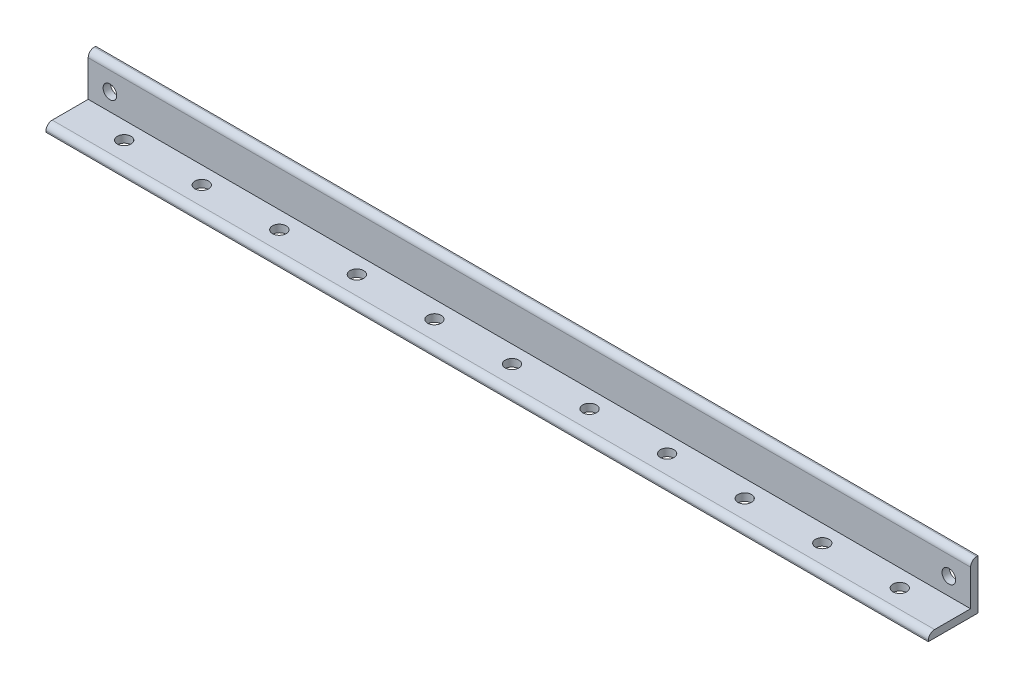
ISO-10303-21;
HEADER;
FILE_DESCRIPTION(('STEP AP214'),'2;1');
FILE_NAME('part.step','',(''),(''),'','','');
FILE_SCHEMA(('AUTOMOTIVE_DESIGN { 1 0 10303 214 1 1 1 1 }'));
ENDSEC;
DATA;
#1=APPLICATION_CONTEXT('core data for automotive mechanical design processes');
#2=APPLICATION_PROTOCOL_DEFINITION('international standard','automotive_design',2000,#1);
#3=PRODUCT_CONTEXT('',#1,'mechanical');
#4=PRODUCT('Part','Part','',(#3));
#5=PRODUCT_RELATED_PRODUCT_CATEGORY('part','',(#4));
#6=PRODUCT_DEFINITION_FORMATION('','',#4);
#7=PRODUCT_DEFINITION_CONTEXT('part definition',#1,'design');
#8=PRODUCT_DEFINITION('design','',#6,#7);
#9=PRODUCT_DEFINITION_SHAPE('','',#8);
#10=(LENGTH_UNIT() NAMED_UNIT(*) SI_UNIT(.MILLI.,.METRE.));
#11=(NAMED_UNIT(*) PLANE_ANGLE_UNIT() SI_UNIT($,.RADIAN.));
#12=(NAMED_UNIT(*) SI_UNIT($,.STERADIAN.) SOLID_ANGLE_UNIT());
#13=UNCERTAINTY_MEASURE_WITH_UNIT(LENGTH_MEASURE(1.E-05),#10,'distance_accuracy_value','');
#14=(GEOMETRIC_REPRESENTATION_CONTEXT(3) GLOBAL_UNCERTAINTY_ASSIGNED_CONTEXT((#13)) GLOBAL_UNIT_ASSIGNED_CONTEXT((#10,
#11,#12)) REPRESENTATION_CONTEXT('',''));
#15=CARTESIAN_POINT('',(0.,0.,0.));
#16=DIRECTION('',(0.,0.,1.));
#17=DIRECTION('',(1.,0.,0.));
#18=AXIS2_PLACEMENT_3D('',#15,#16,#17);
#19=CARTESIAN_POINT('',(0.,0.,80.));
#20=DIRECTION('',(1.,0.,0.));
#21=DIRECTION('',(0.,0.,-1.));
#22=AXIS2_PLACEMENT_3D('',#19,#20,#21);
#23=PLANE('',#22);
#24=DIRECTION('',(0.,-1.,0.));
#25=VECTOR('',#24,1.);
#26=CARTESIAN_POINT('',(0.,0.,80.));
#27=LINE('',#26,#25);
#28=CARTESIAN_POINT('',(0.,2.,80.));
#29=VERTEX_POINT('',#28);
#30=CARTESIAN_POINT('',(0.,0.,80.));
#31=VERTEX_POINT('',#30);
#32=EDGE_CURVE('E128',#29,#31,#27,.T.);
#33=ORIENTED_EDGE('',*,*,#32,.F.);
#34=CARTESIAN_POINT('',(0.,2.,70.));
#35=DIRECTION('',(1.,0.,0.));
#36=DIRECTION('',(0.,0.,-1.));
#37=AXIS2_PLACEMENT_3D('',#34,#35,#36);
#38=CIRCLE('',#37,10.);
#39=CARTESIAN_POINT('',(0.,12.,70.));
#40=VERTEX_POINT('',#39);
#41=EDGE_CURVE('E160',#29,#40,#38,.F.);
#42=ORIENTED_EDGE('',*,*,#41,.T.);
#43=DIRECTION('',(0.,0.,1.));
#44=VECTOR('',#43,1.);
#45=CARTESIAN_POINT('',(0.,12.,12.));
#46=LINE('',#45,#44);
#47=CARTESIAN_POINT('',(0.,12.,12.));
#48=VERTEX_POINT('',#47);
#49=EDGE_CURVE('E106',#48,#40,#46,.T.);
#50=ORIENTED_EDGE('',*,*,#49,.F.);
#51=DIRECTION('',(0.,-1.,0.));
#52=VECTOR('',#51,1.);
#53=CARTESIAN_POINT('',(0.,80.,12.));
#54=LINE('',#53,#52);
#55=CARTESIAN_POINT('',(0.,70.,12.));
#56=VERTEX_POINT('',#55);
#57=EDGE_CURVE('E112',#56,#48,#54,.T.);
#58=ORIENTED_EDGE('',*,*,#57,.F.);
#59=CARTESIAN_POINT('',(0.,70.,2.));
#60=DIRECTION('',(1.,0.,0.));
#61=DIRECTION('',(0.,0.,-1.));
#62=AXIS2_PLACEMENT_3D('',#59,#60,#61);
#63=CIRCLE('',#62,10.);
#64=CARTESIAN_POINT('',(0.,80.,2.));
#65=VERTEX_POINT('',#64);
#66=EDGE_CURVE('E158',#56,#65,#63,.F.);
#67=ORIENTED_EDGE('',*,*,#66,.T.);
#68=DIRECTION('',(0.,0.,-1.));
#69=VECTOR('',#68,1.);
#70=CARTESIAN_POINT('',(0.,80.,80.));
#71=LINE('',#70,#69);
#72=CARTESIAN_POINT('',(0.,80.,0.));
#73=VERTEX_POINT('',#72);
#74=EDGE_CURVE('E136',#65,#73,#71,.T.);
#75=ORIENTED_EDGE('',*,*,#74,.T.);
#76=DIRECTION('',(0.,-1.,0.));
#77=VECTOR('',#76,1.);
#78=CARTESIAN_POINT('',(0.,0.,0.));
#79=LINE('',#78,#77);
#80=CARTESIAN_POINT('',(0.,0.,0.));
#81=VERTEX_POINT('',#80);
#82=EDGE_CURVE('E116',#73,#81,#79,.T.);
#83=ORIENTED_EDGE('',*,*,#82,.T.);
#84=DIRECTION('',(0.,0.,-1.));
#85=VECTOR('',#84,1.);
#86=CARTESIAN_POINT('',(0.,0.,80.));
#87=LINE('',#86,#85);
#88=EDGE_CURVE('E152',#31,#81,#87,.T.);
#89=ORIENTED_EDGE('',*,*,#88,.F.);
#90=EDGE_LOOP('',(#33,#42,#50,#58,#67,#75,#83,#89));
#91=FACE_BOUND('',#90,.T.);
#92=ADVANCED_FACE('F33',(#91),#23,.F.);
#93=CARTESIAN_POINT('',(0.,0.,80.));
#94=DIRECTION('',(0.,1.,0.));
#95=DIRECTION('',(0.,0.,1.));
#96=AXIS2_PLACEMENT_3D('',#93,#94,#95);
#97=PLANE('',#96);
#98=CARTESIAN_POINT('',(211.,0.,40.));
#99=DIRECTION('',(0.,-1.,0.));
#100=DIRECTION('',(0.,0.,-1.));
#101=AXIS2_PLACEMENT_3D('',#98,#99,#100);
#102=CIRCLE('',#101,10.9999999999999);
#103=CARTESIAN_POINT('',(211.,0.,29.0000000000001));
#104=VERTEX_POINT('',#103);
#105=EDGE_CURVE('E481',#104,#104,#102,.T.);
#106=ORIENTED_EDGE('',*,*,#105,.F.);
#107=EDGE_LOOP('',(#106));
#108=FACE_BOUND('',#107,.T.);
#109=CARTESIAN_POINT('',(86.,0.,40.));
#110=DIRECTION('',(0.,-1.,0.));
#111=DIRECTION('',(0.,0.,-1.));
#112=AXIS2_PLACEMENT_3D('',#109,#110,#111);
#113=CIRCLE('',#112,10.9999999999999);
#114=CARTESIAN_POINT('',(86.,0.,29.0000000000001));
#115=VERTEX_POINT('',#114);
#116=EDGE_CURVE('E180',#115,#115,#113,.T.);
#117=ORIENTED_EDGE('',*,*,#116,.F.);
#118=EDGE_LOOP('',(#117));
#119=FACE_BOUND('',#118,.T.);
#120=DIRECTION('',(1.,0.,0.));
#121=VECTOR('',#120,1.);
#122=CARTESIAN_POINT('',(0.,0.,0.));
#123=LINE('',#122,#121);
#124=CARTESIAN_POINT('',(1422.,0.,0.));
#125=VERTEX_POINT('',#124);
#126=EDGE_CURVE('E139',#81,#125,#123,.T.);
#127=ORIENTED_EDGE('',*,*,#126,.T.);
#128=DIRECTION('',(0.,0.,-1.));
#129=VECTOR('',#128,1.);
#130=CARTESIAN_POINT('',(1422.,0.,80.));
#131=LINE('',#130,#129);
#132=CARTESIAN_POINT('',(1422.,0.,80.));
#133=VERTEX_POINT('',#132);
#134=EDGE_CURVE('E149',#133,#125,#131,.T.);
#135=ORIENTED_EDGE('',*,*,#134,.F.);
#136=DIRECTION('',(1.,0.,0.));
#137=VECTOR('',#136,1.);
#138=CARTESIAN_POINT('',(0.,0.,80.));
#139=LINE('',#138,#137);
#140=EDGE_CURVE('E130',#31,#133,#139,.T.);
#141=ORIENTED_EDGE('',*,*,#140,.F.);
#142=ORIENTED_EDGE('',*,*,#88,.T.);
#143=EDGE_LOOP('',(#127,#135,#141,#142));
#144=FACE_BOUND('',#143,.T.);
#145=CARTESIAN_POINT('',(336.,0.,40.));
#146=DIRECTION('',(0.,-1.,0.));
#147=DIRECTION('',(0.,0.,-1.));
#148=AXIS2_PLACEMENT_3D('',#145,#146,#147);
#149=CIRCLE('',#148,10.9999999999999);
#150=CARTESIAN_POINT('',(336.,0.,29.0000000000001));
#151=VERTEX_POINT('',#150);
#152=EDGE_CURVE('E169',#151,#151,#149,.T.);
#153=ORIENTED_EDGE('',*,*,#152,.F.);
#154=EDGE_LOOP('',(#153));
#155=FACE_BOUND('',#154,.T.);
#156=CARTESIAN_POINT('',(461.,0.,40.));
#157=DIRECTION('',(0.,-1.,0.));
#158=DIRECTION('',(0.,0.,-1.));
#159=AXIS2_PLACEMENT_3D('',#156,#157,#158);
#160=CIRCLE('',#159,10.9999999999999);
#161=CARTESIAN_POINT('',(461.,0.,29.0000000000001));
#162=VERTEX_POINT('',#161);
#163=EDGE_CURVE('E186',#162,#162,#160,.T.);
#164=ORIENTED_EDGE('',*,*,#163,.F.);
#165=EDGE_LOOP('',(#164));
#166=FACE_BOUND('',#165,.T.);
#167=CARTESIAN_POINT('',(586.,0.,40.));
#168=DIRECTION('',(0.,-1.,0.));
#169=DIRECTION('',(0.,0.,-1.));
#170=AXIS2_PLACEMENT_3D('',#167,#168,#169);
#171=CIRCLE('',#170,10.9999999999999);
#172=CARTESIAN_POINT('',(586.,0.,29.0000000000001));
#173=VERTEX_POINT('',#172);
#174=EDGE_CURVE('E192',#173,#173,#171,.T.);
#175=ORIENTED_EDGE('',*,*,#174,.F.);
#176=EDGE_LOOP('',(#175));
#177=FACE_BOUND('',#176,.T.);
#178=CARTESIAN_POINT('',(711.,0.,40.));
#179=DIRECTION('',(0.,-1.,0.));
#180=DIRECTION('',(0.,0.,-1.));
#181=AXIS2_PLACEMENT_3D('',#178,#179,#180);
#182=CIRCLE('',#181,10.9999999999999);
#183=CARTESIAN_POINT('',(711.,0.,29.0000000000001));
#184=VERTEX_POINT('',#183);
#185=EDGE_CURVE('E198',#184,#184,#182,.T.);
#186=ORIENTED_EDGE('',*,*,#185,.F.);
#187=EDGE_LOOP('',(#186));
#188=FACE_BOUND('',#187,.T.);
#189=CARTESIAN_POINT('',(836.,0.,40.));
#190=DIRECTION('',(0.,-1.,0.));
#191=DIRECTION('',(0.,0.,-1.));
#192=AXIS2_PLACEMENT_3D('',#189,#190,#191);
#193=CIRCLE('',#192,10.9999999999999);
#194=CARTESIAN_POINT('',(836.,0.,29.0000000000001));
#195=VERTEX_POINT('',#194);
#196=EDGE_CURVE('E204',#195,#195,#193,.T.);
#197=ORIENTED_EDGE('',*,*,#196,.F.);
#198=EDGE_LOOP('',(#197));
#199=FACE_BOUND('',#198,.T.);
#200=CARTESIAN_POINT('',(961.,0.,40.));
#201=DIRECTION('',(0.,-1.,0.));
#202=DIRECTION('',(0.,0.,-1.));
#203=AXIS2_PLACEMENT_3D('',#200,#201,#202);
#204=CIRCLE('',#203,10.9999999999999);
#205=CARTESIAN_POINT('',(961.,0.,29.0000000000001));
#206=VERTEX_POINT('',#205);
#207=EDGE_CURVE('E210',#206,#206,#204,.T.);
#208=ORIENTED_EDGE('',*,*,#207,.F.);
#209=EDGE_LOOP('',(#208));
#210=FACE_BOUND('',#209,.T.);
#211=CARTESIAN_POINT('',(1086.,0.,40.));
#212=DIRECTION('',(0.,-1.,0.));
#213=DIRECTION('',(0.,0.,-1.));
#214=AXIS2_PLACEMENT_3D('',#211,#212,#213);
#215=CIRCLE('',#214,10.9999999999999);
#216=CARTESIAN_POINT('',(1086.,0.,29.0000000000001));
#217=VERTEX_POINT('',#216);
#218=EDGE_CURVE('E216',#217,#217,#215,.T.);
#219=ORIENTED_EDGE('',*,*,#218,.F.);
#220=EDGE_LOOP('',(#219));
#221=FACE_BOUND('',#220,.T.);
#222=CARTESIAN_POINT('',(1211.,0.,40.));
#223=DIRECTION('',(0.,-1.,0.));
#224=DIRECTION('',(0.,0.,-1.));
#225=AXIS2_PLACEMENT_3D('',#222,#223,#224);
#226=CIRCLE('',#225,10.9999999999999);
#227=CARTESIAN_POINT('',(1211.,0.,29.0000000000001));
#228=VERTEX_POINT('',#227);
#229=EDGE_CURVE('E222',#228,#228,#226,.T.);
#230=ORIENTED_EDGE('',*,*,#229,.F.);
#231=EDGE_LOOP('',(#230));
#232=FACE_BOUND('',#231,.T.);
#233=CARTESIAN_POINT('',(1336.,0.,40.));
#234=DIRECTION('',(0.,-1.,0.));
#235=DIRECTION('',(0.,0.,-1.));
#236=AXIS2_PLACEMENT_3D('',#233,#234,#235);
#237=CIRCLE('',#236,10.9999999999999);
#238=CARTESIAN_POINT('',(1336.,0.,29.0000000000001));
#239=VERTEX_POINT('',#238);
#240=EDGE_CURVE('E41',#239,#239,#237,.T.);
#241=ORIENTED_EDGE('',*,*,#240,.F.);
#242=EDGE_LOOP('',(#241));
#243=FACE_BOUND('',#242,.T.);
#244=ADVANCED_FACE('F232',(#108,#119,#144,#155,#166,#177,#188,#199,#210,#221,#232,#243),#97,.F.);
#245=CARTESIAN_POINT('',(1422.,0.,80.));
#246=DIRECTION('',(-1.,0.,0.));
#247=DIRECTION('',(0.,0.,1.));
#248=AXIS2_PLACEMENT_3D('',#245,#246,#247);
#249=PLANE('',#248);
#250=DIRECTION('',(0.,0.,1.));
#251=VECTOR('',#250,1.);
#252=CARTESIAN_POINT('',(1422.,12.,12.));
#253=LINE('',#252,#251);
#254=CARTESIAN_POINT('',(1422.,12.,12.));
#255=VERTEX_POINT('',#254);
#256=CARTESIAN_POINT('',(1422.,12.,70.));
#257=VERTEX_POINT('',#256);
#258=EDGE_CURVE('E101',#255,#257,#253,.T.);
#259=ORIENTED_EDGE('',*,*,#258,.T.);
#260=CARTESIAN_POINT('',(1422.,2.,70.));
#261=DIRECTION('',(-1.,0.,0.));
#262=DIRECTION('',(0.,0.,1.));
#263=AXIS2_PLACEMENT_3D('',#260,#261,#262);
#264=CIRCLE('',#263,10.);
#265=CARTESIAN_POINT('',(1422.,2.,80.));
#266=VERTEX_POINT('',#265);
#267=EDGE_CURVE('E164',#257,#266,#264,.F.);
#268=ORIENTED_EDGE('',*,*,#267,.T.);
#269=DIRECTION('',(0.,1.,0.));
#270=VECTOR('',#269,1.);
#271=CARTESIAN_POINT('',(1422.,0.,80.));
#272=LINE('',#271,#270);
#273=EDGE_CURVE('E133',#133,#266,#272,.T.);
#274=ORIENTED_EDGE('',*,*,#273,.F.);
#275=ORIENTED_EDGE('',*,*,#134,.T.);
#276=DIRECTION('',(0.,1.,0.));
#277=VECTOR('',#276,1.);
#278=CARTESIAN_POINT('',(1422.,0.,0.));
#279=LINE('',#278,#277);
#280=CARTESIAN_POINT('',(1422.,80.,0.));
#281=VERTEX_POINT('',#280);
#282=EDGE_CURVE('E141',#125,#281,#279,.T.);
#283=ORIENTED_EDGE('',*,*,#282,.T.);
#284=DIRECTION('',(0.,0.,-1.));
#285=VECTOR('',#284,1.);
#286=CARTESIAN_POINT('',(1422.,80.,80.));
#287=LINE('',#286,#285);
#288=CARTESIAN_POINT('',(1422.,80.,2.));
#289=VERTEX_POINT('',#288);
#290=EDGE_CURVE('E147',#289,#281,#287,.T.);
#291=ORIENTED_EDGE('',*,*,#290,.F.);
#292=CARTESIAN_POINT('',(1422.,70.,2.));
#293=DIRECTION('',(-1.,0.,0.));
#294=DIRECTION('',(0.,0.,1.));
#295=AXIS2_PLACEMENT_3D('',#292,#293,#294);
#296=CIRCLE('',#295,10.);
#297=CARTESIAN_POINT('',(1422.,70.,12.));
#298=VERTEX_POINT('',#297);
#299=EDGE_CURVE('E48',#289,#298,#296,.F.);
#300=ORIENTED_EDGE('',*,*,#299,.T.);
#301=DIRECTION('',(0.,-1.,0.));
#302=VECTOR('',#301,1.);
#303=CARTESIAN_POINT('',(1422.,80.,12.));
#304=LINE('',#303,#302);
#305=EDGE_CURVE('E97',#298,#255,#304,.T.);
#306=ORIENTED_EDGE('',*,*,#305,.T.);
#307=EDGE_LOOP('',(#259,#268,#274,#275,#283,#291,#300,#306));
#308=FACE_BOUND('',#307,.T.);
#309=ADVANCED_FACE('F99',(#308),#249,.F.);
#310=CARTESIAN_POINT('',(0.,80.,80.));
#311=DIRECTION('',(0.,-1.,0.));
#312=DIRECTION('',(0.,0.,-1.));
#313=AXIS2_PLACEMENT_3D('',#310,#311,#312);
#314=PLANE('',#313);
#315=ORIENTED_EDGE('',*,*,#74,.F.);
#316=DIRECTION('',(-1.,0.,0.));
#317=VECTOR('',#316,1.);
#318=CARTESIAN_POINT('',(0.,80.,2.));
#319=LINE('',#318,#317);
#320=EDGE_CURVE('E56',#65,#289,#319,.F.);
#321=ORIENTED_EDGE('',*,*,#320,.T.);
#322=ORIENTED_EDGE('',*,*,#290,.T.);
#323=DIRECTION('',(-1.,0.,0.));
#324=VECTOR('',#323,1.);
#325=CARTESIAN_POINT('',(0.,80.,0.));
#326=LINE('',#325,#324);
#327=EDGE_CURVE('E131',#281,#73,#326,.T.);
#328=ORIENTED_EDGE('',*,*,#327,.T.);
#329=EDGE_LOOP('',(#315,#321,#322,#328));
#330=FACE_BOUND('',#329,.T.);
#331=ADVANCED_FACE('F240',(#330),#314,.F.);
#332=CARTESIAN_POINT('',(0.,80.,80.));
#333=DIRECTION('',(0.,0.,-1.));
#334=DIRECTION('',(-1.,0.,0.));
#335=AXIS2_PLACEMENT_3D('',#332,#333,#334);
#336=PLANE('',#335);
#337=ORIENTED_EDGE('',*,*,#273,.T.);
#338=DIRECTION('',(-1.,0.,0.));
#339=VECTOR('',#338,1.);
#340=CARTESIAN_POINT('',(0.,2.,80.));
#341=LINE('',#340,#339);
#342=EDGE_CURVE('E155',#266,#29,#341,.T.);
#343=ORIENTED_EDGE('',*,*,#342,.T.);
#344=ORIENTED_EDGE('',*,*,#32,.T.);
#345=ORIENTED_EDGE('',*,*,#140,.T.);
#346=EDGE_LOOP('',(#337,#343,#344,#345));
#347=FACE_BOUND('',#346,.T.);
#348=ADVANCED_FACE('F311',(#347),#336,.F.);
#349=CARTESIAN_POINT('',(0.,80.,0.));
#350=DIRECTION('',(0.,0.,-1.));
#351=DIRECTION('',(-1.,0.,0.));
#352=AXIS2_PLACEMENT_3D('',#349,#350,#351);
#353=PLANE('',#352);
#354=CARTESIAN_POINT('',(34.9999999999999,40.,0.));
#355=DIRECTION('',(0.,0.,-1.));
#356=DIRECTION('',(-1.,0.,0.));
#357=AXIS2_PLACEMENT_3D('',#354,#355,#356);
#358=CIRCLE('',#357,10.9999999999999);
#359=CARTESIAN_POINT('',(24.,40.,0.));
#360=VERTEX_POINT('',#359);
#361=EDGE_CURVE('E176',#360,#360,#358,.T.);
#362=ORIENTED_EDGE('',*,*,#361,.F.);
#363=EDGE_LOOP('',(#362));
#364=FACE_BOUND('',#363,.T.);
#365=CARTESIAN_POINT('',(1387.,40.,0.));
#366=DIRECTION('',(0.,0.,-1.));
#367=DIRECTION('',(-1.,0.,0.));
#368=AXIS2_PLACEMENT_3D('',#365,#366,#367);
#369=CIRCLE('',#368,10.9999999999999);
#370=CARTESIAN_POINT('',(1376.,40.,0.));
#371=VERTEX_POINT('',#370);
#372=EDGE_CURVE('E172',#371,#371,#369,.T.);
#373=ORIENTED_EDGE('',*,*,#372,.F.);
#374=EDGE_LOOP('',(#373));
#375=FACE_BOUND('',#374,.T.);
#376=ORIENTED_EDGE('',*,*,#82,.F.);
#377=ORIENTED_EDGE('',*,*,#327,.F.);
#378=ORIENTED_EDGE('',*,*,#282,.F.);
#379=ORIENTED_EDGE('',*,*,#126,.F.);
#380=EDGE_LOOP('',(#376,#377,#378,#379));
#381=FACE_BOUND('',#380,.T.);
#382=ADVANCED_FACE('F303',(#364,#375,#381),#353,.T.);
#383=CARTESIAN_POINT('',(1422.,80.,12.));
#384=DIRECTION('',(0.,0.,-1.));
#385=DIRECTION('',(0.,1.,0.));
#386=AXIS2_PLACEMENT_3D('',#383,#384,#385);
#387=PLANE('',#386);
#388=CARTESIAN_POINT('',(34.9999999999999,40.,12.));
#389=DIRECTION('',(0.,0.,-1.));
#390=DIRECTION('',(0.,1.,0.));
#391=AXIS2_PLACEMENT_3D('',#388,#389,#390);
#392=CIRCLE('',#391,10.9999999999999);
#393=CARTESIAN_POINT('',(34.9999999999999,50.9999999999999,12.));
#394=VERTEX_POINT('',#393);
#395=EDGE_CURVE('E173',#394,#394,#392,.T.);
#396=ORIENTED_EDGE('',*,*,#395,.T.);
#397=EDGE_LOOP('',(#396));
#398=FACE_BOUND('',#397,.T.);
#399=CARTESIAN_POINT('',(1387.,40.,12.));
#400=DIRECTION('',(0.,0.,-1.));
#401=DIRECTION('',(0.,1.,0.));
#402=AXIS2_PLACEMENT_3D('',#399,#400,#401);
#403=CIRCLE('',#402,10.9999999999999);
#404=CARTESIAN_POINT('',(1387.,50.9999999999999,12.));
#405=VERTEX_POINT('',#404);
#406=EDGE_CURVE('E126',#405,#405,#403,.T.);
#407=ORIENTED_EDGE('',*,*,#406,.T.);
#408=EDGE_LOOP('',(#407));
#409=FACE_BOUND('',#408,.T.);
#410=ORIENTED_EDGE('',*,*,#305,.F.);
#411=DIRECTION('',(-1.,0.,0.));
#412=VECTOR('',#411,1.);
#413=CARTESIAN_POINT('',(1422.,70.,12.));
#414=LINE('',#413,#412);
#415=EDGE_CURVE('E166',#298,#56,#414,.T.);
#416=ORIENTED_EDGE('',*,*,#415,.T.);
#417=ORIENTED_EDGE('',*,*,#57,.T.);
#418=DIRECTION('',(-1.,0.,0.));
#419=VECTOR('',#418,1.);
#420=CARTESIAN_POINT('',(1422.,12.,12.));
#421=LINE('',#420,#419);
#422=EDGE_CURVE('E109',#255,#48,#421,.T.);
#423=ORIENTED_EDGE('',*,*,#422,.F.);
#424=EDGE_LOOP('',(#410,#416,#417,#423));
#425=FACE_BOUND('',#424,.T.);
#426=ADVANCED_FACE('F110',(#398,#409,#425),#387,.F.);
#427=CARTESIAN_POINT('',(1422.,12.,12.));
#428=DIRECTION('',(0.,-1.,0.));
#429=DIRECTION('',(0.,0.,-1.));
#430=AXIS2_PLACEMENT_3D('',#427,#428,#429);
#431=PLANE('',#430);
#432=CARTESIAN_POINT('',(211.,12.,40.));
#433=DIRECTION('',(0.,-1.,0.));
#434=DIRECTION('',(0.,0.,-1.));
#435=AXIS2_PLACEMENT_3D('',#432,#433,#434);
#436=CIRCLE('',#435,10.9999999999999);
#437=CARTESIAN_POINT('',(211.,12.,29.0000000000001));
#438=VERTEX_POINT('',#437);
#439=EDGE_CURVE('E483',#438,#438,#436,.T.);
#440=ORIENTED_EDGE('',*,*,#439,.T.);
#441=EDGE_LOOP('',(#440));
#442=FACE_BOUND('',#441,.T.);
#443=CARTESIAN_POINT('',(86.,12.,40.));
#444=DIRECTION('',(0.,-1.,0.));
#445=DIRECTION('',(0.,0.,-1.));
#446=AXIS2_PLACEMENT_3D('',#443,#444,#445);
#447=CIRCLE('',#446,10.9999999999999);
#448=CARTESIAN_POINT('',(86.,12.,29.0000000000001));
#449=VERTEX_POINT('',#448);
#450=EDGE_CURVE('E177',#449,#449,#447,.T.);
#451=ORIENTED_EDGE('',*,*,#450,.T.);
#452=EDGE_LOOP('',(#451));
#453=FACE_BOUND('',#452,.T.);
#454=ORIENTED_EDGE('',*,*,#49,.T.);
#455=DIRECTION('',(-1.,0.,0.));
#456=VECTOR('',#455,1.);
#457=CARTESIAN_POINT('',(1422.,12.,70.));
#458=LINE('',#457,#456);
#459=EDGE_CURVE('E121',#40,#257,#458,.F.);
#460=ORIENTED_EDGE('',*,*,#459,.T.);
#461=ORIENTED_EDGE('',*,*,#258,.F.);
#462=ORIENTED_EDGE('',*,*,#422,.T.);
#463=EDGE_LOOP('',(#454,#460,#461,#462));
#464=FACE_BOUND('',#463,.T.);
#465=CARTESIAN_POINT('',(336.,12.,40.));
#466=DIRECTION('',(0.,-1.,0.));
#467=DIRECTION('',(0.,0.,-1.));
#468=AXIS2_PLACEMENT_3D('',#465,#466,#467);
#469=CIRCLE('',#468,10.9999999999999);
#470=CARTESIAN_POINT('',(336.,12.,29.0000000000001));
#471=VERTEX_POINT('',#470);
#472=EDGE_CURVE('E183',#471,#471,#469,.T.);
#473=ORIENTED_EDGE('',*,*,#472,.T.);
#474=EDGE_LOOP('',(#473));
#475=FACE_BOUND('',#474,.T.);
#476=CARTESIAN_POINT('',(461.,12.,40.));
#477=DIRECTION('',(0.,-1.,0.));
#478=DIRECTION('',(0.,0.,-1.));
#479=AXIS2_PLACEMENT_3D('',#476,#477,#478);
#480=CIRCLE('',#479,10.9999999999999);
#481=CARTESIAN_POINT('',(461.,12.,29.0000000000001));
#482=VERTEX_POINT('',#481);
#483=EDGE_CURVE('E189',#482,#482,#480,.T.);
#484=ORIENTED_EDGE('',*,*,#483,.T.);
#485=EDGE_LOOP('',(#484));
#486=FACE_BOUND('',#485,.T.);
#487=CARTESIAN_POINT('',(586.,12.,40.));
#488=DIRECTION('',(0.,-1.,0.));
#489=DIRECTION('',(0.,0.,-1.));
#490=AXIS2_PLACEMENT_3D('',#487,#488,#489);
#491=CIRCLE('',#490,10.9999999999999);
#492=CARTESIAN_POINT('',(586.,12.,29.0000000000001));
#493=VERTEX_POINT('',#492);
#494=EDGE_CURVE('E195',#493,#493,#491,.T.);
#495=ORIENTED_EDGE('',*,*,#494,.T.);
#496=EDGE_LOOP('',(#495));
#497=FACE_BOUND('',#496,.T.);
#498=CARTESIAN_POINT('',(711.,12.,40.));
#499=DIRECTION('',(0.,-1.,0.));
#500=DIRECTION('',(0.,0.,-1.));
#501=AXIS2_PLACEMENT_3D('',#498,#499,#500);
#502=CIRCLE('',#501,10.9999999999999);
#503=CARTESIAN_POINT('',(711.,12.,29.0000000000001));
#504=VERTEX_POINT('',#503);
#505=EDGE_CURVE('E201',#504,#504,#502,.T.);
#506=ORIENTED_EDGE('',*,*,#505,.T.);
#507=EDGE_LOOP('',(#506));
#508=FACE_BOUND('',#507,.T.);
#509=CARTESIAN_POINT('',(836.,12.,40.));
#510=DIRECTION('',(0.,-1.,0.));
#511=DIRECTION('',(0.,0.,-1.));
#512=AXIS2_PLACEMENT_3D('',#509,#510,#511);
#513=CIRCLE('',#512,10.9999999999999);
#514=CARTESIAN_POINT('',(836.,12.,29.0000000000001));
#515=VERTEX_POINT('',#514);
#516=EDGE_CURVE('E207',#515,#515,#513,.T.);
#517=ORIENTED_EDGE('',*,*,#516,.T.);
#518=EDGE_LOOP('',(#517));
#519=FACE_BOUND('',#518,.T.);
#520=CARTESIAN_POINT('',(961.,12.,40.));
#521=DIRECTION('',(0.,-1.,0.));
#522=DIRECTION('',(0.,0.,-1.));
#523=AXIS2_PLACEMENT_3D('',#520,#521,#522);
#524=CIRCLE('',#523,10.9999999999999);
#525=CARTESIAN_POINT('',(961.,12.,29.0000000000001));
#526=VERTEX_POINT('',#525);
#527=EDGE_CURVE('E213',#526,#526,#524,.T.);
#528=ORIENTED_EDGE('',*,*,#527,.T.);
#529=EDGE_LOOP('',(#528));
#530=FACE_BOUND('',#529,.T.);
#531=CARTESIAN_POINT('',(1086.,12.,40.));
#532=DIRECTION('',(0.,-1.,0.));
#533=DIRECTION('',(0.,0.,-1.));
#534=AXIS2_PLACEMENT_3D('',#531,#532,#533);
#535=CIRCLE('',#534,10.9999999999999);
#536=CARTESIAN_POINT('',(1086.,12.,29.0000000000001));
#537=VERTEX_POINT('',#536);
#538=EDGE_CURVE('E219',#537,#537,#535,.T.);
#539=ORIENTED_EDGE('',*,*,#538,.T.);
#540=EDGE_LOOP('',(#539));
#541=FACE_BOUND('',#540,.T.);
#542=CARTESIAN_POINT('',(1211.,12.,40.));
#543=DIRECTION('',(0.,-1.,0.));
#544=DIRECTION('',(0.,0.,-1.));
#545=AXIS2_PLACEMENT_3D('',#542,#543,#544);
#546=CIRCLE('',#545,10.9999999999999);
#547=CARTESIAN_POINT('',(1211.,12.,29.0000000000001));
#548=VERTEX_POINT('',#547);
#549=EDGE_CURVE('E225',#548,#548,#546,.T.);
#550=ORIENTED_EDGE('',*,*,#549,.T.);
#551=EDGE_LOOP('',(#550));
#552=FACE_BOUND('',#551,.T.);
#553=CARTESIAN_POINT('',(1336.,12.,40.));
#554=DIRECTION('',(0.,-1.,0.));
#555=DIRECTION('',(0.,0.,-1.));
#556=AXIS2_PLACEMENT_3D('',#553,#554,#555);
#557=CIRCLE('',#556,10.9999999999999);
#558=CARTESIAN_POINT('',(1336.,12.,29.0000000000001));
#559=VERTEX_POINT('',#558);
#560=EDGE_CURVE('E11',#559,#559,#557,.T.);
#561=ORIENTED_EDGE('',*,*,#560,.T.);
#562=EDGE_LOOP('',(#561));
#563=FACE_BOUND('',#562,.T.);
#564=ADVANCED_FACE('F118',(#442,#453,#464,#475,#486,#497,#508,#519,#530,#541,#552,#563),#431,.F.);
#565=CARTESIAN_POINT('',(0.,2.,70.));
#566=DIRECTION('',(-1.,0.,0.));
#567=DIRECTION('',(0.,0.,1.));
#568=AXIS2_PLACEMENT_3D('',#565,#566,#567);
#569=CYLINDRICAL_SURFACE('',#568,10.);
#570=ORIENTED_EDGE('',*,*,#267,.F.);
#571=ORIENTED_EDGE('',*,*,#459,.F.);
#572=ORIENTED_EDGE('',*,*,#41,.F.);
#573=ORIENTED_EDGE('',*,*,#342,.F.);
#574=EDGE_LOOP('',(#570,#571,#572,#573));
#575=FACE_BOUND('',#574,.T.);
#576=ADVANCED_FACE('F248',(#575),#569,.T.);
#577=CARTESIAN_POINT('',(1422.,70.,2.));
#578=DIRECTION('',(-1.,0.,0.));
#579=DIRECTION('',(0.,0.,1.));
#580=AXIS2_PLACEMENT_3D('',#577,#578,#579);
#581=CYLINDRICAL_SURFACE('',#580,10.);
#582=ORIENTED_EDGE('',*,*,#299,.F.);
#583=ORIENTED_EDGE('',*,*,#320,.F.);
#584=ORIENTED_EDGE('',*,*,#66,.F.);
#585=ORIENTED_EDGE('',*,*,#415,.F.);
#586=EDGE_LOOP('',(#582,#583,#584,#585));
#587=FACE_BOUND('',#586,.T.);
#588=ADVANCED_FACE('F251',(#587),#581,.T.);
#589=CARTESIAN_POINT('',(1387.,40.,80.));
#590=DIRECTION('',(0.,0.,-1.));
#591=DIRECTION('',(-1.,0.,0.));
#592=AXIS2_PLACEMENT_3D('',#589,#590,#591);
#593=CYLINDRICAL_SURFACE('',#592,10.9999999999999);
#594=ORIENTED_EDGE('',*,*,#372,.T.);
#595=EDGE_LOOP('',(#594));
#596=FACE_BOUND('',#595,.T.);
#597=ORIENTED_EDGE('',*,*,#406,.F.);
#598=EDGE_LOOP('',(#597));
#599=FACE_BOUND('',#598,.T.);
#600=ADVANCED_FACE('F255',(#596,#599),#593,.F.);
#601=CARTESIAN_POINT('',(34.9999999999999,40.,80.));
#602=DIRECTION('',(0.,0.,-1.));
#603=DIRECTION('',(-1.,0.,0.));
#604=AXIS2_PLACEMENT_3D('',#601,#602,#603);
#605=CYLINDRICAL_SURFACE('',#604,10.9999999999999);
#606=ORIENTED_EDGE('',*,*,#361,.T.);
#607=EDGE_LOOP('',(#606));
#608=FACE_BOUND('',#607,.T.);
#609=ORIENTED_EDGE('',*,*,#395,.F.);
#610=EDGE_LOOP('',(#609));
#611=FACE_BOUND('',#610,.T.);
#612=ADVANCED_FACE('F388',(#608,#611),#605,.F.);
#613=CARTESIAN_POINT('',(86.,80.,40.));
#614=DIRECTION('',(0.,-1.,0.));
#615=DIRECTION('',(0.,0.,-1.));
#616=AXIS2_PLACEMENT_3D('',#613,#614,#615);
#617=CYLINDRICAL_SURFACE('',#616,10.9999999999999);
#618=ORIENTED_EDGE('',*,*,#116,.T.);
#619=EDGE_LOOP('',(#618));
#620=FACE_BOUND('',#619,.T.);
#621=ORIENTED_EDGE('',*,*,#450,.F.);
#622=EDGE_LOOP('',(#621));
#623=FACE_BOUND('',#622,.T.);
#624=ADVANCED_FACE('F393',(#620,#623),#617,.F.);
#625=CARTESIAN_POINT('',(211.,80.,40.));
#626=DIRECTION('',(0.,-1.,0.));
#627=DIRECTION('',(0.,0.,-1.));
#628=AXIS2_PLACEMENT_3D('',#625,#626,#627);
#629=CYLINDRICAL_SURFACE('',#628,10.9999999999999);
#630=ORIENTED_EDGE('',*,*,#105,.T.);
#631=EDGE_LOOP('',(#630));
#632=FACE_BOUND('',#631,.T.);
#633=ORIENTED_EDGE('',*,*,#439,.F.);
#634=EDGE_LOOP('',(#633));
#635=FACE_BOUND('',#634,.T.);
#636=ADVANCED_FACE('F261',(#632,#635),#629,.F.);
#637=CARTESIAN_POINT('',(336.,80.,40.));
#638=DIRECTION('',(0.,-1.,0.));
#639=DIRECTION('',(0.,0.,-1.));
#640=AXIS2_PLACEMENT_3D('',#637,#638,#639);
#641=CYLINDRICAL_SURFACE('',#640,10.9999999999999);
#642=ORIENTED_EDGE('',*,*,#152,.T.);
#643=EDGE_LOOP('',(#642));
#644=FACE_BOUND('',#643,.T.);
#645=ORIENTED_EDGE('',*,*,#472,.F.);
#646=EDGE_LOOP('',(#645));
#647=FACE_BOUND('',#646,.T.);
#648=ADVANCED_FACE('F257',(#644,#647),#641,.F.);
#649=CARTESIAN_POINT('',(461.,80.,40.));
#650=DIRECTION('',(0.,-1.,0.));
#651=DIRECTION('',(0.,0.,-1.));
#652=AXIS2_PLACEMENT_3D('',#649,#650,#651);
#653=CYLINDRICAL_SURFACE('',#652,10.9999999999999);
#654=ORIENTED_EDGE('',*,*,#163,.T.);
#655=EDGE_LOOP('',(#654));
#656=FACE_BOUND('',#655,.T.);
#657=ORIENTED_EDGE('',*,*,#483,.F.);
#658=EDGE_LOOP('',(#657));
#659=FACE_BOUND('',#658,.T.);
#660=ADVANCED_FACE('F260',(#656,#659),#653,.F.);
#661=CARTESIAN_POINT('',(586.,80.,40.));
#662=DIRECTION('',(0.,-1.,0.));
#663=DIRECTION('',(0.,0.,-1.));
#664=AXIS2_PLACEMENT_3D('',#661,#662,#663);
#665=CYLINDRICAL_SURFACE('',#664,10.9999999999999);
#666=ORIENTED_EDGE('',*,*,#174,.T.);
#667=EDGE_LOOP('',(#666));
#668=FACE_BOUND('',#667,.T.);
#669=ORIENTED_EDGE('',*,*,#494,.F.);
#670=EDGE_LOOP('',(#669));
#671=FACE_BOUND('',#670,.T.);
#672=ADVANCED_FACE('F265',(#668,#671),#665,.F.);
#673=CARTESIAN_POINT('',(711.,80.,40.));
#674=DIRECTION('',(0.,-1.,0.));
#675=DIRECTION('',(0.,0.,-1.));
#676=AXIS2_PLACEMENT_3D('',#673,#674,#675);
#677=CYLINDRICAL_SURFACE('',#676,10.9999999999999);
#678=ORIENTED_EDGE('',*,*,#185,.T.);
#679=EDGE_LOOP('',(#678));
#680=FACE_BOUND('',#679,.T.);
#681=ORIENTED_EDGE('',*,*,#505,.F.);
#682=EDGE_LOOP('',(#681));
#683=FACE_BOUND('',#682,.T.);
#684=ADVANCED_FACE('F269',(#680,#683),#677,.F.);
#685=CARTESIAN_POINT('',(836.,80.,40.));
#686=DIRECTION('',(0.,-1.,0.));
#687=DIRECTION('',(0.,0.,-1.));
#688=AXIS2_PLACEMENT_3D('',#685,#686,#687);
#689=CYLINDRICAL_SURFACE('',#688,10.9999999999999);
#690=ORIENTED_EDGE('',*,*,#196,.T.);
#691=EDGE_LOOP('',(#690));
#692=FACE_BOUND('',#691,.T.);
#693=ORIENTED_EDGE('',*,*,#516,.F.);
#694=EDGE_LOOP('',(#693));
#695=FACE_BOUND('',#694,.T.);
#696=ADVANCED_FACE('F273',(#692,#695),#689,.F.);
#697=CARTESIAN_POINT('',(961.,80.,40.));
#698=DIRECTION('',(0.,-1.,0.));
#699=DIRECTION('',(0.,0.,-1.));
#700=AXIS2_PLACEMENT_3D('',#697,#698,#699);
#701=CYLINDRICAL_SURFACE('',#700,10.9999999999999);
#702=ORIENTED_EDGE('',*,*,#207,.T.);
#703=EDGE_LOOP('',(#702));
#704=FACE_BOUND('',#703,.T.);
#705=ORIENTED_EDGE('',*,*,#527,.F.);
#706=EDGE_LOOP('',(#705));
#707=FACE_BOUND('',#706,.T.);
#708=ADVANCED_FACE('F277',(#704,#707),#701,.F.);
#709=CARTESIAN_POINT('',(1086.,80.,40.));
#710=DIRECTION('',(0.,-1.,0.));
#711=DIRECTION('',(0.,0.,-1.));
#712=AXIS2_PLACEMENT_3D('',#709,#710,#711);
#713=CYLINDRICAL_SURFACE('',#712,10.9999999999999);
#714=ORIENTED_EDGE('',*,*,#218,.T.);
#715=EDGE_LOOP('',(#714));
#716=FACE_BOUND('',#715,.T.);
#717=ORIENTED_EDGE('',*,*,#538,.F.);
#718=EDGE_LOOP('',(#717));
#719=FACE_BOUND('',#718,.T.);
#720=ADVANCED_FACE('F281',(#716,#719),#713,.F.);
#721=CARTESIAN_POINT('',(1211.,80.,40.));
#722=DIRECTION('',(0.,-1.,0.));
#723=DIRECTION('',(0.,0.,-1.));
#724=AXIS2_PLACEMENT_3D('',#721,#722,#723);
#725=CYLINDRICAL_SURFACE('',#724,10.9999999999999);
#726=ORIENTED_EDGE('',*,*,#229,.T.);
#727=EDGE_LOOP('',(#726));
#728=FACE_BOUND('',#727,.T.);
#729=ORIENTED_EDGE('',*,*,#549,.F.);
#730=EDGE_LOOP('',(#729));
#731=FACE_BOUND('',#730,.T.);
#732=ADVANCED_FACE('F284',(#728,#731),#725,.F.);
#733=CARTESIAN_POINT('',(1336.,80.,40.));
#734=DIRECTION('',(0.,-1.,0.));
#735=DIRECTION('',(0.,0.,-1.));
#736=AXIS2_PLACEMENT_3D('',#733,#734,#735);
#737=CYLINDRICAL_SURFACE('',#736,10.9999999999999);
#738=ORIENTED_EDGE('',*,*,#240,.T.);
#739=EDGE_LOOP('',(#738));
#740=FACE_BOUND('',#739,.T.);
#741=ORIENTED_EDGE('',*,*,#560,.F.);
#742=EDGE_LOOP('',(#741));
#743=FACE_BOUND('',#742,.T.);
#744=ADVANCED_FACE('F35',(#740,#743),#737,.F.);
#745=CLOSED_SHELL('',(#92,#244,#309,#331,#348,#382,#426,#564,#576,#588,#600,#612,#624,#636,#648,
#660,#672,#684,#696,#708,#720,#732,#744));
#746=MANIFOLD_SOLID_BREP('B2',#745);
#747=ADVANCED_BREP_SHAPE_REPRESENTATION('',(#18,#746),#14);
#748=SHAPE_DEFINITION_REPRESENTATION(#9,#747);
ENDSEC;
END-ISO-10303-21;
